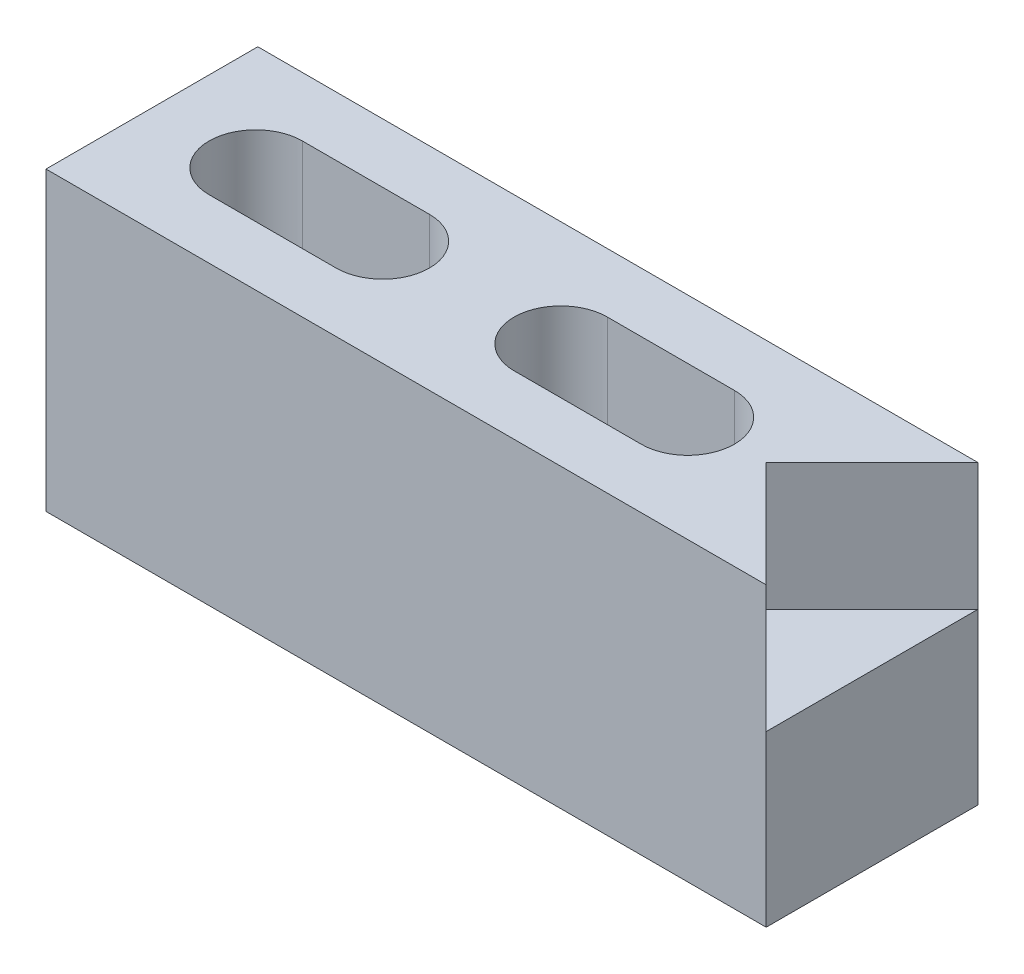
ISO-10303-21;
HEADER;
FILE_DESCRIPTION(('STEP AP214'),'2;1');
FILE_NAME('part.step','',(''),(''),'','','');
FILE_SCHEMA(('AUTOMOTIVE_DESIGN { 1 0 10303 214 1 1 1 1 }'));
ENDSEC;
DATA;
#1=APPLICATION_CONTEXT('core data for automotive mechanical design processes');
#2=APPLICATION_PROTOCOL_DEFINITION('international standard','automotive_design',2000,#1);
#3=PRODUCT_CONTEXT('',#1,'mechanical');
#4=PRODUCT('Part','Part','',(#3));
#5=PRODUCT_RELATED_PRODUCT_CATEGORY('part','',(#4));
#6=PRODUCT_DEFINITION_FORMATION('','',#4);
#7=PRODUCT_DEFINITION_CONTEXT('part definition',#1,'design');
#8=PRODUCT_DEFINITION('design','',#6,#7);
#9=PRODUCT_DEFINITION_SHAPE('','',#8);
#10=(LENGTH_UNIT() NAMED_UNIT(*) SI_UNIT(.MILLI.,.METRE.));
#11=(NAMED_UNIT(*) PLANE_ANGLE_UNIT() SI_UNIT($,.RADIAN.));
#12=(NAMED_UNIT(*) SI_UNIT($,.STERADIAN.) SOLID_ANGLE_UNIT());
#13=UNCERTAINTY_MEASURE_WITH_UNIT(LENGTH_MEASURE(1.E-05),#10,'distance_accuracy_value','');
#14=(GEOMETRIC_REPRESENTATION_CONTEXT(3) GLOBAL_UNCERTAINTY_ASSIGNED_CONTEXT((#13)) GLOBAL_UNIT_ASSIGNED_CONTEXT((#10,
#11,#12)) REPRESENTATION_CONTEXT('',''));
#15=CARTESIAN_POINT('',(0.,0.,0.));
#16=DIRECTION('',(0.,0.,1.));
#17=DIRECTION('',(1.,0.,0.));
#18=AXIS2_PLACEMENT_3D('',#15,#16,#17);
#19=CARTESIAN_POINT('',(43.18,0.,-12.7));
#20=DIRECTION('',(1.,0.,0.));
#21=DIRECTION('',(0.,0.,-1.));
#22=AXIS2_PLACEMENT_3D('',#19,#20,#21);
#23=PLANE('',#22);
#24=DIRECTION('',(0.,1.,0.));
#25=VECTOR('',#24,1.);
#26=CARTESIAN_POINT('',(43.18,0.,-12.7));
#27=LINE('',#26,#25);
#28=CARTESIAN_POINT('',(43.18,0.,-12.7));
#29=VERTEX_POINT('',#28);
#30=CARTESIAN_POINT('',(43.18,10.16,-12.7));
#31=VERTEX_POINT('',#30);
#32=EDGE_CURVE('E233',#29,#31,#27,.T.);
#33=ORIENTED_EDGE('',*,*,#32,.T.);
#34=DIRECTION('',(0.,0.,-1.));
#35=VECTOR('',#34,1.);
#36=CARTESIAN_POINT('',(43.18,10.16,-12.7));
#37=LINE('',#36,#35);
#38=CARTESIAN_POINT('',(43.18,10.16,0.));
#39=VERTEX_POINT('',#38);
#40=EDGE_CURVE('E205',#39,#31,#37,.T.);
#41=ORIENTED_EDGE('',*,*,#40,.F.);
#42=DIRECTION('',(0.,1.,0.));
#43=VECTOR('',#42,1.);
#44=CARTESIAN_POINT('',(43.18,0.,0.));
#45=LINE('',#44,#43);
#46=CARTESIAN_POINT('',(43.18,0.,0.));
#47=VERTEX_POINT('',#46);
#48=EDGE_CURVE('E244',#47,#39,#45,.T.);
#49=ORIENTED_EDGE('',*,*,#48,.F.);
#50=DIRECTION('',(0.,0.,1.));
#51=VECTOR('',#50,1.);
#52=CARTESIAN_POINT('',(43.18,0.,-12.7));
#53=LINE('',#52,#51);
#54=EDGE_CURVE('E42',#29,#47,#53,.T.);
#55=ORIENTED_EDGE('',*,*,#54,.F.);
#56=EDGE_LOOP('',(#33,#41,#49,#55));
#57=FACE_BOUND('',#56,.T.);
#58=ADVANCED_FACE('F33',(#57),#23,.T.);
#59=CARTESIAN_POINT('',(0.,0.,-12.7));
#60=DIRECTION('',(-1.,0.,0.));
#61=DIRECTION('',(0.,0.,1.));
#62=AXIS2_PLACEMENT_3D('',#59,#60,#61);
#63=PLANE('',#62);
#64=DIRECTION('',(0.,-1.,0.));
#65=VECTOR('',#64,1.);
#66=CARTESIAN_POINT('',(0.,0.,0.));
#67=LINE('',#66,#65);
#68=CARTESIAN_POINT('',(0.,17.78,0.));
#69=VERTEX_POINT('',#68);
#70=CARTESIAN_POINT('',(0.,0.,0.));
#71=VERTEX_POINT('',#70);
#72=EDGE_CURVE('E222',#69,#71,#67,.T.);
#73=ORIENTED_EDGE('',*,*,#72,.F.);
#74=DIRECTION('',(0.,0.,1.));
#75=VECTOR('',#74,1.);
#76=CARTESIAN_POINT('',(0.,17.78,-12.7));
#77=LINE('',#76,#75);
#78=CARTESIAN_POINT('',(0.,17.78,-12.7));
#79=VERTEX_POINT('',#78);
#80=EDGE_CURVE('E11',#79,#69,#77,.T.);
#81=ORIENTED_EDGE('',*,*,#80,.F.);
#82=DIRECTION('',(0.,-1.,0.));
#83=VECTOR('',#82,1.);
#84=CARTESIAN_POINT('',(0.,0.,-12.7));
#85=LINE('',#84,#83);
#86=CARTESIAN_POINT('',(0.,0.,-12.7));
#87=VERTEX_POINT('',#86);
#88=EDGE_CURVE('E226',#79,#87,#85,.T.);
#89=ORIENTED_EDGE('',*,*,#88,.T.);
#90=DIRECTION('',(0.,0.,1.));
#91=VECTOR('',#90,1.);
#92=CARTESIAN_POINT('',(0.,0.,-12.7));
#93=LINE('',#92,#91);
#94=EDGE_CURVE('E37',#87,#71,#93,.T.);
#95=ORIENTED_EDGE('',*,*,#94,.T.);
#96=EDGE_LOOP('',(#73,#81,#89,#95));
#97=FACE_BOUND('',#96,.T.);
#98=ADVANCED_FACE('F35',(#97),#63,.T.);
#99=CARTESIAN_POINT('',(0.,17.78,-12.7));
#100=DIRECTION('',(0.,1.,0.));
#101=DIRECTION('',(0.,0.,1.));
#102=AXIS2_PLACEMENT_3D('',#99,#100,#101);
#103=PLANE('',#102);
#104=CARTESIAN_POINT('',(32.131,17.78,-6.35));
#105=DIRECTION('',(0.,1.,0.));
#106=DIRECTION('',(0.,0.,1.));
#107=AXIS2_PLACEMENT_3D('',#104,#105,#106);
#108=CIRCLE('',#107,2.794);
#109=CARTESIAN_POINT('',(32.131,17.78,-3.556));
#110=VERTEX_POINT('',#109);
#111=CARTESIAN_POINT('',(32.131,17.78,-9.144));
#112=VERTEX_POINT('',#111);
#113=EDGE_CURVE('E50',#110,#112,#108,.T.);
#114=ORIENTED_EDGE('',*,*,#113,.F.);
#115=DIRECTION('',(1.,0.,0.));
#116=VECTOR('',#115,1.);
#117=CARTESIAN_POINT('',(32.131,17.78,-3.556));
#118=LINE('',#117,#116);
#119=CARTESIAN_POINT('',(24.511,17.78,-3.556));
#120=VERTEX_POINT('',#119);
#121=EDGE_CURVE('E156',#120,#110,#118,.T.);
#122=ORIENTED_EDGE('',*,*,#121,.F.);
#123=CARTESIAN_POINT('',(24.511,17.78,-6.35));
#124=DIRECTION('',(0.,1.,0.));
#125=DIRECTION('',(0.,0.,1.));
#126=AXIS2_PLACEMENT_3D('',#123,#124,#125);
#127=CIRCLE('',#126,2.794);
#128=CARTESIAN_POINT('',(24.511,17.78,-9.144));
#129=VERTEX_POINT('',#128);
#130=EDGE_CURVE('E159',#129,#120,#127,.T.);
#131=ORIENTED_EDGE('',*,*,#130,.F.);
#132=DIRECTION('',(-1.,0.,0.));
#133=VECTOR('',#132,1.);
#134=CARTESIAN_POINT('',(32.131,17.78,-9.144));
#135=LINE('',#134,#133);
#136=EDGE_CURVE('E165',#112,#129,#135,.T.);
#137=ORIENTED_EDGE('',*,*,#136,.F.);
#138=EDGE_LOOP('',(#114,#122,#131,#137));
#139=FACE_BOUND('',#138,.T.);
#140=CARTESIAN_POINT('',(13.843,17.78,-6.35));
#141=DIRECTION('',(0.,1.,0.));
#142=DIRECTION('',(0.,0.,1.));
#143=AXIS2_PLACEMENT_3D('',#140,#141,#142);
#144=CIRCLE('',#143,2.794);
#145=CARTESIAN_POINT('',(13.843,17.78,-3.556));
#146=VERTEX_POINT('',#145);
#147=CARTESIAN_POINT('',(13.843,17.78,-9.144));
#148=VERTEX_POINT('',#147);
#149=EDGE_CURVE('E58',#146,#148,#144,.T.);
#150=ORIENTED_EDGE('',*,*,#149,.F.);
#151=DIRECTION('',(1.,0.,0.));
#152=VECTOR('',#151,1.);
#153=CARTESIAN_POINT('',(13.843,17.78,-3.556));
#154=LINE('',#153,#152);
#155=CARTESIAN_POINT('',(6.22299999999997,17.78,-3.556));
#156=VERTEX_POINT('',#155);
#157=EDGE_CURVE('E180',#156,#146,#154,.T.);
#158=ORIENTED_EDGE('',*,*,#157,.F.);
#159=CARTESIAN_POINT('',(6.22299999999997,17.78,-6.35));
#160=DIRECTION('',(0.,1.,0.));
#161=DIRECTION('',(0.,0.,1.));
#162=AXIS2_PLACEMENT_3D('',#159,#160,#161);
#163=CIRCLE('',#162,2.794);
#164=CARTESIAN_POINT('',(6.22299999999997,17.78,-9.144));
#165=VERTEX_POINT('',#164);
#166=EDGE_CURVE('E194',#165,#156,#163,.T.);
#167=ORIENTED_EDGE('',*,*,#166,.F.);
#168=DIRECTION('',(-1.,0.,0.));
#169=VECTOR('',#168,1.);
#170=CARTESIAN_POINT('',(13.843,17.78,-9.144));
#171=LINE('',#170,#169);
#172=EDGE_CURVE('E191',#148,#165,#171,.T.);
#173=ORIENTED_EDGE('',*,*,#172,.F.);
#174=EDGE_LOOP('',(#150,#158,#167,#173));
#175=FACE_BOUND('',#174,.T.);
#176=DIRECTION('',(0.707106781186549,0.,0.707106781186546));
#177=VECTOR('',#176,1.);
#178=CARTESIAN_POINT('',(36.83,17.78,-6.35));
#179=LINE('',#178,#177);
#180=CARTESIAN_POINT('',(36.83,17.78,-6.35));
#181=VERTEX_POINT('',#180);
#182=CARTESIAN_POINT('',(43.18,17.78,0.));
#183=VERTEX_POINT('',#182);
#184=EDGE_CURVE('E209',#181,#183,#179,.T.);
#185=ORIENTED_EDGE('',*,*,#184,.F.);
#186=DIRECTION('',(-0.707106781186549,0.,0.707106781186546));
#187=VECTOR('',#186,1.);
#188=CARTESIAN_POINT('',(43.18,17.78,-12.7));
#189=LINE('',#188,#187);
#190=CARTESIAN_POINT('',(43.18,17.78,-12.7));
#191=VERTEX_POINT('',#190);
#192=EDGE_CURVE('E172',#191,#181,#189,.T.);
#193=ORIENTED_EDGE('',*,*,#192,.F.);
#194=DIRECTION('',(-1.,0.,0.));
#195=VECTOR('',#194,1.);
#196=CARTESIAN_POINT('',(0.,17.78,-12.7));
#197=LINE('',#196,#195);
#198=EDGE_CURVE('E236',#191,#79,#197,.T.);
#199=ORIENTED_EDGE('',*,*,#198,.T.);
#200=ORIENTED_EDGE('',*,*,#80,.T.);
#201=DIRECTION('',(-1.,0.,0.));
#202=VECTOR('',#201,1.);
#203=CARTESIAN_POINT('',(0.,17.78,0.));
#204=LINE('',#203,#202);
#205=EDGE_CURVE('E230',#183,#69,#204,.T.);
#206=ORIENTED_EDGE('',*,*,#205,.F.);
#207=EDGE_LOOP('',(#185,#193,#199,#200,#206));
#208=FACE_BOUND('',#207,.T.);
#209=ADVANCED_FACE('F260',(#139,#175,#208),#103,.T.);
#210=CARTESIAN_POINT('',(0.,0.,-12.7));
#211=DIRECTION('',(0.,-1.,0.));
#212=DIRECTION('',(0.,0.,-1.));
#213=AXIS2_PLACEMENT_3D('',#210,#211,#212);
#214=PLANE('',#213);
#215=CARTESIAN_POINT('',(32.131,0.,-6.35));
#216=DIRECTION('',(0.,1.,0.));
#217=DIRECTION('',(0.,0.,1.));
#218=AXIS2_PLACEMENT_3D('',#215,#216,#217);
#219=CIRCLE('',#218,2.794);
#220=CARTESIAN_POINT('',(32.131,0.,-3.556));
#221=VERTEX_POINT('',#220);
#222=CARTESIAN_POINT('',(32.131,0.,-9.144));
#223=VERTEX_POINT('',#222);
#224=EDGE_CURVE('E137',#221,#223,#219,.T.);
#225=ORIENTED_EDGE('',*,*,#224,.T.);
#226=DIRECTION('',(-1.,0.,0.));
#227=VECTOR('',#226,1.);
#228=CARTESIAN_POINT('',(32.131,0.,-9.144));
#229=LINE('',#228,#227);
#230=CARTESIAN_POINT('',(24.511,0.,-9.144));
#231=VERTEX_POINT('',#230);
#232=EDGE_CURVE('E147',#223,#231,#229,.T.);
#233=ORIENTED_EDGE('',*,*,#232,.T.);
#234=CARTESIAN_POINT('',(24.511,0.,-6.35));
#235=DIRECTION('',(0.,1.,0.));
#236=DIRECTION('',(0.,0.,1.));
#237=AXIS2_PLACEMENT_3D('',#234,#235,#236);
#238=CIRCLE('',#237,2.794);
#239=CARTESIAN_POINT('',(24.511,0.,-3.556));
#240=VERTEX_POINT('',#239);
#241=EDGE_CURVE('E151',#231,#240,#238,.T.);
#242=ORIENTED_EDGE('',*,*,#241,.T.);
#243=DIRECTION('',(1.,0.,0.));
#244=VECTOR('',#243,1.);
#245=CARTESIAN_POINT('',(32.131,0.,-3.556));
#246=LINE('',#245,#244);
#247=EDGE_CURVE('E143',#240,#221,#246,.T.);
#248=ORIENTED_EDGE('',*,*,#247,.T.);
#249=EDGE_LOOP('',(#225,#233,#242,#248));
#250=FACE_BOUND('',#249,.T.);
#251=CARTESIAN_POINT('',(13.843,0.,-6.35));
#252=DIRECTION('',(0.,1.,0.));
#253=DIRECTION('',(0.,0.,1.));
#254=AXIS2_PLACEMENT_3D('',#251,#252,#253);
#255=CIRCLE('',#254,2.794);
#256=CARTESIAN_POINT('',(13.843,0.,-3.556));
#257=VERTEX_POINT('',#256);
#258=CARTESIAN_POINT('',(13.843,0.,-9.144));
#259=VERTEX_POINT('',#258);
#260=EDGE_CURVE('E176',#257,#259,#255,.T.);
#261=ORIENTED_EDGE('',*,*,#260,.T.);
#262=DIRECTION('',(-1.,0.,0.));
#263=VECTOR('',#262,1.);
#264=CARTESIAN_POINT('',(13.843,0.,-9.144));
#265=LINE('',#264,#263);
#266=CARTESIAN_POINT('',(6.22299999999997,0.,-9.144));
#267=VERTEX_POINT('',#266);
#268=EDGE_CURVE('E179',#259,#267,#265,.T.);
#269=ORIENTED_EDGE('',*,*,#268,.T.);
#270=CARTESIAN_POINT('',(6.22299999999997,0.,-6.35));
#271=DIRECTION('',(0.,1.,0.));
#272=DIRECTION('',(0.,0.,1.));
#273=AXIS2_PLACEMENT_3D('',#270,#271,#272);
#274=CIRCLE('',#273,2.794);
#275=CARTESIAN_POINT('',(6.22299999999997,0.,-3.556));
#276=VERTEX_POINT('',#275);
#277=EDGE_CURVE('E183',#267,#276,#274,.T.);
#278=ORIENTED_EDGE('',*,*,#277,.T.);
#279=DIRECTION('',(1.,0.,0.));
#280=VECTOR('',#279,1.);
#281=CARTESIAN_POINT('',(13.843,0.,-3.556));
#282=LINE('',#281,#280);
#283=EDGE_CURVE('E186',#276,#257,#282,.T.);
#284=ORIENTED_EDGE('',*,*,#283,.T.);
#285=EDGE_LOOP('',(#261,#269,#278,#284));
#286=FACE_BOUND('',#285,.T.);
#287=DIRECTION('',(1.,0.,0.));
#288=VECTOR('',#287,1.);
#289=CARTESIAN_POINT('',(0.,0.,0.));
#290=LINE('',#289,#288);
#291=EDGE_CURVE('E241',#71,#47,#290,.T.);
#292=ORIENTED_EDGE('',*,*,#291,.F.);
#293=ORIENTED_EDGE('',*,*,#94,.F.);
#294=DIRECTION('',(1.,0.,0.));
#295=VECTOR('',#294,1.);
#296=CARTESIAN_POINT('',(0.,0.,-12.7));
#297=LINE('',#296,#295);
#298=EDGE_CURVE('E229',#87,#29,#297,.T.);
#299=ORIENTED_EDGE('',*,*,#298,.T.);
#300=ORIENTED_EDGE('',*,*,#54,.T.);
#301=EDGE_LOOP('',(#292,#293,#299,#300));
#302=FACE_BOUND('',#301,.T.);
#303=ADVANCED_FACE('F153',(#250,#286,#302),#214,.T.);
#304=CARTESIAN_POINT('',(0.,0.,-12.7));
#305=DIRECTION('',(0.,0.,-1.));
#306=DIRECTION('',(-1.,0.,0.));
#307=AXIS2_PLACEMENT_3D('',#304,#305,#306);
#308=PLANE('',#307);
#309=ORIENTED_EDGE('',*,*,#88,.F.);
#310=ORIENTED_EDGE('',*,*,#198,.F.);
#311=DIRECTION('',(0.,1.,0.));
#312=VECTOR('',#311,1.);
#313=CARTESIAN_POINT('',(43.18,10.16,-12.7));
#314=LINE('',#313,#312);
#315=EDGE_CURVE('E215',#31,#191,#314,.T.);
#316=ORIENTED_EDGE('',*,*,#315,.F.);
#317=ORIENTED_EDGE('',*,*,#32,.F.);
#318=ORIENTED_EDGE('',*,*,#298,.F.);
#319=EDGE_LOOP('',(#309,#310,#316,#317,#318));
#320=FACE_BOUND('',#319,.T.);
#321=ADVANCED_FACE('F264',(#320),#308,.T.);
#322=CARTESIAN_POINT('',(0.,0.,0.));
#323=DIRECTION('',(0.,0.,-1.));
#324=DIRECTION('',(-1.,0.,0.));
#325=AXIS2_PLACEMENT_3D('',#322,#323,#324);
#326=PLANE('',#325);
#327=ORIENTED_EDGE('',*,*,#72,.T.);
#328=ORIENTED_EDGE('',*,*,#291,.T.);
#329=ORIENTED_EDGE('',*,*,#48,.T.);
#330=DIRECTION('',(0.,1.,0.));
#331=VECTOR('',#330,1.);
#332=CARTESIAN_POINT('',(43.18,10.16,0.));
#333=LINE('',#332,#331);
#334=EDGE_CURVE('E219',#39,#183,#333,.T.);
#335=ORIENTED_EDGE('',*,*,#334,.T.);
#336=ORIENTED_EDGE('',*,*,#205,.T.);
#337=EDGE_LOOP('',(#327,#328,#329,#335,#336));
#338=FACE_BOUND('',#337,.T.);
#339=ADVANCED_FACE('F256',(#338),#326,.F.);
#340=CARTESIAN_POINT('',(36.83,10.16,-6.35));
#341=DIRECTION('',(-0.707106781186546,0.,0.707106781186549));
#342=DIRECTION('',(0.707106781186549,0.,0.707106781186546));
#343=AXIS2_PLACEMENT_3D('',#340,#341,#342);
#344=PLANE('',#343);
#345=ORIENTED_EDGE('',*,*,#184,.T.);
#346=ORIENTED_EDGE('',*,*,#334,.F.);
#347=DIRECTION('',(0.707106781186549,0.,0.707106781186546));
#348=VECTOR('',#347,1.);
#349=CARTESIAN_POINT('',(36.83,10.16,-6.35));
#350=LINE('',#349,#348);
#351=CARTESIAN_POINT('',(36.83,10.16,-6.35));
#352=VERTEX_POINT('',#351);
#353=EDGE_CURVE('E212',#352,#39,#350,.T.);
#354=ORIENTED_EDGE('',*,*,#353,.F.);
#355=DIRECTION('',(0.,1.,0.));
#356=VECTOR('',#355,1.);
#357=CARTESIAN_POINT('',(36.83,10.16,-6.35));
#358=LINE('',#357,#356);
#359=EDGE_CURVE('E223',#352,#181,#358,.T.);
#360=ORIENTED_EDGE('',*,*,#359,.T.);
#361=EDGE_LOOP('',(#345,#346,#354,#360));
#362=FACE_BOUND('',#361,.T.);
#363=ADVANCED_FACE('F273',(#362),#344,.F.);
#364=CARTESIAN_POINT('',(43.18,10.16,-12.7));
#365=DIRECTION('',(-0.707106781186546,0.,-0.707106781186549));
#366=DIRECTION('',(-0.707106781186549,0.,0.707106781186546));
#367=AXIS2_PLACEMENT_3D('',#364,#365,#366);
#368=PLANE('',#367);
#369=ORIENTED_EDGE('',*,*,#192,.T.);
#370=ORIENTED_EDGE('',*,*,#359,.F.);
#371=DIRECTION('',(-0.707106781186549,0.,0.707106781186546));
#372=VECTOR('',#371,1.);
#373=CARTESIAN_POINT('',(43.18,10.16,-12.7));
#374=LINE('',#373,#372);
#375=EDGE_CURVE('E208',#31,#352,#374,.T.);
#376=ORIENTED_EDGE('',*,*,#375,.F.);
#377=ORIENTED_EDGE('',*,*,#315,.T.);
#378=EDGE_LOOP('',(#369,#370,#376,#377));
#379=FACE_BOUND('',#378,.T.);
#380=ADVANCED_FACE('F275',(#379),#368,.F.);
#381=CARTESIAN_POINT('',(0.,10.16,0.));
#382=DIRECTION('',(0.,1.,0.));
#383=DIRECTION('',(-1.,0.,0.));
#384=AXIS2_PLACEMENT_3D('',#381,#382,#383);
#385=PLANE('',#384);
#386=ORIENTED_EDGE('',*,*,#40,.T.);
#387=ORIENTED_EDGE('',*,*,#375,.T.);
#388=ORIENTED_EDGE('',*,*,#353,.T.);
#389=EDGE_LOOP('',(#386,#387,#388));
#390=FACE_BOUND('',#389,.T.);
#391=ADVANCED_FACE('F270',(#390),#385,.T.);
#392=CARTESIAN_POINT('',(13.843,0.,-6.35));
#393=DIRECTION('',(0.,1.,0.));
#394=DIRECTION('',(0.,0.,1.));
#395=AXIS2_PLACEMENT_3D('',#392,#393,#394);
#396=CYLINDRICAL_SURFACE('',#395,2.794);
#397=ORIENTED_EDGE('',*,*,#149,.T.);
#398=DIRECTION('',(0.,1.,0.));
#399=VECTOR('',#398,1.);
#400=CARTESIAN_POINT('',(13.843,0.,-9.144));
#401=LINE('',#400,#399);
#402=EDGE_CURVE('E189',#259,#148,#401,.T.);
#403=ORIENTED_EDGE('',*,*,#402,.F.);
#404=ORIENTED_EDGE('',*,*,#260,.F.);
#405=DIRECTION('',(0.,1.,0.));
#406=VECTOR('',#405,1.);
#407=CARTESIAN_POINT('',(13.843,0.,-3.556));
#408=LINE('',#407,#406);
#409=EDGE_CURVE('E166',#257,#146,#408,.T.);
#410=ORIENTED_EDGE('',*,*,#409,.T.);
#411=EDGE_LOOP('',(#397,#403,#404,#410));
#412=FACE_BOUND('',#411,.T.);
#413=ADVANCED_FACE('F282',(#412),#396,.F.);
#414=CARTESIAN_POINT('',(13.843,0.,-3.556));
#415=DIRECTION('',(0.,0.,1.));
#416=DIRECTION('',(1.,0.,0.));
#417=AXIS2_PLACEMENT_3D('',#414,#415,#416);
#418=PLANE('',#417);
#419=ORIENTED_EDGE('',*,*,#157,.T.);
#420=ORIENTED_EDGE('',*,*,#409,.F.);
#421=ORIENTED_EDGE('',*,*,#283,.F.);
#422=DIRECTION('',(0.,1.,0.));
#423=VECTOR('',#422,1.);
#424=CARTESIAN_POINT('',(6.22299999999997,0.,-3.556));
#425=LINE('',#424,#423);
#426=EDGE_CURVE('E200',#276,#156,#425,.T.);
#427=ORIENTED_EDGE('',*,*,#426,.T.);
#428=EDGE_LOOP('',(#419,#420,#421,#427));
#429=FACE_BOUND('',#428,.T.);
#430=ADVANCED_FACE('F313',(#429),#418,.F.);
#431=CARTESIAN_POINT('',(6.22299999999997,0.,-6.35));
#432=DIRECTION('',(0.,1.,0.));
#433=DIRECTION('',(0.,0.,1.));
#434=AXIS2_PLACEMENT_3D('',#431,#432,#433);
#435=CYLINDRICAL_SURFACE('',#434,2.794);
#436=ORIENTED_EDGE('',*,*,#166,.T.);
#437=ORIENTED_EDGE('',*,*,#426,.F.);
#438=ORIENTED_EDGE('',*,*,#277,.F.);
#439=DIRECTION('',(0.,1.,0.));
#440=VECTOR('',#439,1.);
#441=CARTESIAN_POINT('',(6.22299999999997,0.,-9.144));
#442=LINE('',#441,#440);
#443=EDGE_CURVE('E202',#267,#165,#442,.T.);
#444=ORIENTED_EDGE('',*,*,#443,.T.);
#445=EDGE_LOOP('',(#436,#437,#438,#444));
#446=FACE_BOUND('',#445,.T.);
#447=ADVANCED_FACE('F315',(#446),#435,.F.);
#448=CARTESIAN_POINT('',(13.843,0.,-9.144));
#449=DIRECTION('',(0.,0.,-1.));
#450=DIRECTION('',(-1.,0.,0.));
#451=AXIS2_PLACEMENT_3D('',#448,#449,#450);
#452=PLANE('',#451);
#453=ORIENTED_EDGE('',*,*,#172,.T.);
#454=ORIENTED_EDGE('',*,*,#443,.F.);
#455=ORIENTED_EDGE('',*,*,#268,.F.);
#456=ORIENTED_EDGE('',*,*,#402,.T.);
#457=EDGE_LOOP('',(#453,#454,#455,#456));
#458=FACE_BOUND('',#457,.T.);
#459=ADVANCED_FACE('F308',(#458),#452,.F.);
#460=CARTESIAN_POINT('',(32.131,0.,-6.35));
#461=DIRECTION('',(0.,1.,0.));
#462=DIRECTION('',(0.,0.,1.));
#463=AXIS2_PLACEMENT_3D('',#460,#461,#462);
#464=CYLINDRICAL_SURFACE('',#463,2.794);
#465=ORIENTED_EDGE('',*,*,#113,.T.);
#466=DIRECTION('',(0.,1.,0.));
#467=VECTOR('',#466,1.);
#468=CARTESIAN_POINT('',(32.131,0.,-9.144));
#469=LINE('',#468,#467);
#470=EDGE_CURVE('E133',#223,#112,#469,.T.);
#471=ORIENTED_EDGE('',*,*,#470,.F.);
#472=ORIENTED_EDGE('',*,*,#224,.F.);
#473=DIRECTION('',(0.,1.,0.));
#474=VECTOR('',#473,1.);
#475=CARTESIAN_POINT('',(32.131,0.,-3.556));
#476=LINE('',#475,#474);
#477=EDGE_CURVE('E170',#221,#110,#476,.T.);
#478=ORIENTED_EDGE('',*,*,#477,.T.);
#479=EDGE_LOOP('',(#465,#471,#472,#478));
#480=FACE_BOUND('',#479,.T.);
#481=ADVANCED_FACE('F135',(#480),#464,.F.);
#482=CARTESIAN_POINT('',(32.131,0.,-3.556));
#483=DIRECTION('',(0.,0.,1.));
#484=DIRECTION('',(1.,0.,0.));
#485=AXIS2_PLACEMENT_3D('',#482,#483,#484);
#486=PLANE('',#485);
#487=ORIENTED_EDGE('',*,*,#121,.T.);
#488=ORIENTED_EDGE('',*,*,#477,.F.);
#489=ORIENTED_EDGE('',*,*,#247,.F.);
#490=DIRECTION('',(0.,1.,0.));
#491=VECTOR('',#490,1.);
#492=CARTESIAN_POINT('',(24.511,0.,-3.556));
#493=LINE('',#492,#491);
#494=EDGE_CURVE('E173',#240,#120,#493,.T.);
#495=ORIENTED_EDGE('',*,*,#494,.T.);
#496=EDGE_LOOP('',(#487,#488,#489,#495));
#497=FACE_BOUND('',#496,.T.);
#498=ADVANCED_FACE('F354',(#497),#486,.F.);
#499=CARTESIAN_POINT('',(24.511,0.,-6.35));
#500=DIRECTION('',(0.,1.,0.));
#501=DIRECTION('',(0.,0.,1.));
#502=AXIS2_PLACEMENT_3D('',#499,#500,#501);
#503=CYLINDRICAL_SURFACE('',#502,2.794);
#504=ORIENTED_EDGE('',*,*,#130,.T.);
#505=ORIENTED_EDGE('',*,*,#494,.F.);
#506=ORIENTED_EDGE('',*,*,#241,.F.);
#507=DIRECTION('',(0.,1.,0.));
#508=VECTOR('',#507,1.);
#509=CARTESIAN_POINT('',(24.511,0.,-9.144));
#510=LINE('',#509,#508);
#511=EDGE_CURVE('E142',#231,#129,#510,.T.);
#512=ORIENTED_EDGE('',*,*,#511,.T.);
#513=EDGE_LOOP('',(#504,#505,#506,#512));
#514=FACE_BOUND('',#513,.T.);
#515=ADVANCED_FACE('F362',(#514),#503,.F.);
#516=CARTESIAN_POINT('',(32.131,0.,-9.144));
#517=DIRECTION('',(0.,0.,-1.));
#518=DIRECTION('',(-1.,0.,0.));
#519=AXIS2_PLACEMENT_3D('',#516,#517,#518);
#520=PLANE('',#519);
#521=ORIENTED_EDGE('',*,*,#136,.T.);
#522=ORIENTED_EDGE('',*,*,#511,.F.);
#523=ORIENTED_EDGE('',*,*,#232,.F.);
#524=ORIENTED_EDGE('',*,*,#470,.T.);
#525=EDGE_LOOP('',(#521,#522,#523,#524));
#526=FACE_BOUND('',#525,.T.);
#527=ADVANCED_FACE('F148',(#526),#520,.F.);
#528=CLOSED_SHELL('',(#58,#98,#209,#303,#321,#339,#363,#380,#391,#413,#430,#447,#459,#481,#498,
#515,#527));
#529=MANIFOLD_SOLID_BREP('B2',#528);
#530=ADVANCED_BREP_SHAPE_REPRESENTATION('',(#18,#529),#14);
#531=SHAPE_DEFINITION_REPRESENTATION(#9,#530);
ENDSEC;
END-ISO-10303-21;
